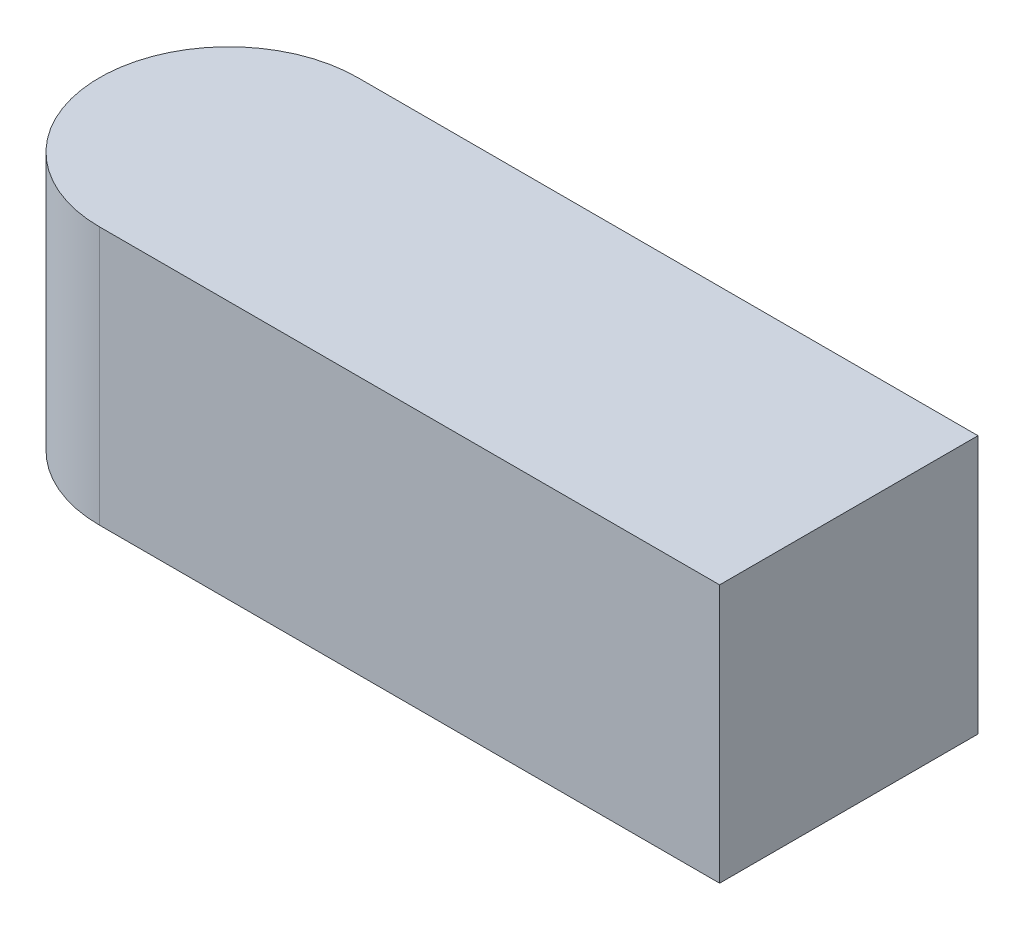
ISO-10303-21;
HEADER;
FILE_DESCRIPTION(('STEP AP214'),'2;1');
FILE_NAME('part.step','',(''),(''),'','','');
FILE_SCHEMA(('AUTOMOTIVE_DESIGN { 1 0 10303 214 1 1 1 1 }'));
ENDSEC;
DATA;
#1=APPLICATION_CONTEXT('core data for automotive mechanical design processes');
#2=APPLICATION_PROTOCOL_DEFINITION('international standard','automotive_design',2000,#1);
#3=PRODUCT_CONTEXT('',#1,'mechanical');
#4=PRODUCT('Part','Part','',(#3));
#5=PRODUCT_RELATED_PRODUCT_CATEGORY('part','',(#4));
#6=PRODUCT_DEFINITION_FORMATION('','',#4);
#7=PRODUCT_DEFINITION_CONTEXT('part definition',#1,'design');
#8=PRODUCT_DEFINITION('design','',#6,#7);
#9=PRODUCT_DEFINITION_SHAPE('','',#8);
#10=(LENGTH_UNIT() NAMED_UNIT(*) SI_UNIT(.MILLI.,.METRE.));
#11=(NAMED_UNIT(*) PLANE_ANGLE_UNIT() SI_UNIT($,.RADIAN.));
#12=(NAMED_UNIT(*) SI_UNIT($,.STERADIAN.) SOLID_ANGLE_UNIT());
#13=UNCERTAINTY_MEASURE_WITH_UNIT(LENGTH_MEASURE(1.E-05),#10,'distance_accuracy_value','');
#14=(GEOMETRIC_REPRESENTATION_CONTEXT(3) GLOBAL_UNCERTAINTY_ASSIGNED_CONTEXT((#13)) GLOBAL_UNIT_ASSIGNED_CONTEXT((#10,
#11,#12)) REPRESENTATION_CONTEXT('',''));
#15=CARTESIAN_POINT('',(0.,0.,0.));
#16=DIRECTION('',(0.,0.,1.));
#17=DIRECTION('',(1.,0.,0.));
#18=AXIS2_PLACEMENT_3D('',#15,#16,#17);
#19=CARTESIAN_POINT('',(0.,5.,0.));
#20=DIRECTION('',(0.,1.,0.));
#21=DIRECTION('',(1.,0.,0.));
#22=AXIS2_PLACEMENT_3D('',#19,#20,#21);
#23=PLANE('',#22);
#24=DIRECTION('',(-1.,0.,0.));
#25=VECTOR('',#24,1.);
#26=CARTESIAN_POINT('',(0.,5.,2.5));
#27=LINE('',#26,#25);
#28=CARTESIAN_POINT('',(12.,5.,2.5));
#29=VERTEX_POINT('',#28);
#30=CARTESIAN_POINT('',(0.,5.,2.5));
#31=VERTEX_POINT('',#30);
#32=EDGE_CURVE('E111',#29,#31,#27,.T.);
#33=ORIENTED_EDGE('',*,*,#32,.F.);
#34=DIRECTION('',(0.,0.,1.));
#35=VECTOR('',#34,1.);
#36=CARTESIAN_POINT('',(12.,5.,2.5));
#37=LINE('',#36,#35);
#38=CARTESIAN_POINT('',(12.,5.,-2.5));
#39=VERTEX_POINT('',#38);
#40=EDGE_CURVE('E104',#39,#29,#37,.T.);
#41=ORIENTED_EDGE('',*,*,#40,.F.);
#42=DIRECTION('',(1.,0.,0.));
#43=VECTOR('',#42,1.);
#44=CARTESIAN_POINT('',(12.,5.,-2.5));
#45=LINE('',#44,#43);
#46=CARTESIAN_POINT('',(0.,5.,-2.5));
#47=VERTEX_POINT('',#46);
#48=EDGE_CURVE('E11',#47,#39,#45,.T.);
#49=ORIENTED_EDGE('',*,*,#48,.F.);
#50=CARTESIAN_POINT('',(0.,5.,0.));
#51=DIRECTION('',(0.,-1.,0.));
#52=DIRECTION('',(0.,0.,1.));
#53=AXIS2_PLACEMENT_3D('',#50,#51,#52);
#54=CIRCLE('',#53,2.5);
#55=EDGE_CURVE('E44',#31,#47,#54,.T.);
#56=ORIENTED_EDGE('',*,*,#55,.F.);
#57=EDGE_LOOP('',(#33,#41,#49,#56));
#58=FACE_BOUND('',#57,.T.);
#59=ADVANCED_FACE('F17',(#58),#23,.T.);
#60=CARTESIAN_POINT('',(12.,0.,-2.5));
#61=DIRECTION('',(0.,0.,-1.));
#62=DIRECTION('',(0.,-1.,0.));
#63=AXIS2_PLACEMENT_3D('',#60,#61,#62);
#64=PLANE('',#63);
#65=DIRECTION('',(0.,-1.,0.));
#66=VECTOR('',#65,1.);
#67=CARTESIAN_POINT('',(0.,0.,-2.5));
#68=LINE('',#67,#66);
#69=CARTESIAN_POINT('',(0.,0.,-2.5));
#70=VERTEX_POINT('',#69);
#71=EDGE_CURVE('E25',#47,#70,#68,.T.);
#72=ORIENTED_EDGE('',*,*,#71,.F.);
#73=ORIENTED_EDGE('',*,*,#48,.T.);
#74=DIRECTION('',(0.,1.,0.));
#75=VECTOR('',#74,1.);
#76=CARTESIAN_POINT('',(12.,0.,-2.5));
#77=LINE('',#76,#75);
#78=CARTESIAN_POINT('',(12.,0.,-2.5));
#79=VERTEX_POINT('',#78);
#80=EDGE_CURVE('E83',#79,#39,#77,.T.);
#81=ORIENTED_EDGE('',*,*,#80,.F.);
#82=DIRECTION('',(-1.,0.,0.));
#83=VECTOR('',#82,1.);
#84=CARTESIAN_POINT('',(0.,0.,-2.5));
#85=LINE('',#84,#83);
#86=EDGE_CURVE('E80',#79,#70,#85,.T.);
#87=ORIENTED_EDGE('',*,*,#86,.T.);
#88=EDGE_LOOP('',(#72,#73,#81,#87));
#89=FACE_BOUND('',#88,.T.);
#90=ADVANCED_FACE('F81',(#89),#64,.T.);
#91=CARTESIAN_POINT('',(0.,0.,0.));
#92=DIRECTION('',(0.,1.,0.));
#93=DIRECTION('',(0.,0.,1.));
#94=AXIS2_PLACEMENT_3D('',#91,#92,#93);
#95=CYLINDRICAL_SURFACE('',#94,2.5);
#96=DIRECTION('',(0.,-1.,0.));
#97=VECTOR('',#96,1.);
#98=CARTESIAN_POINT('',(0.,0.,2.5));
#99=LINE('',#98,#97);
#100=CARTESIAN_POINT('',(0.,0.,2.5));
#101=VERTEX_POINT('',#100);
#102=EDGE_CURVE('E115',#31,#101,#99,.T.);
#103=ORIENTED_EDGE('',*,*,#102,.F.);
#104=ORIENTED_EDGE('',*,*,#55,.T.);
#105=ORIENTED_EDGE('',*,*,#71,.T.);
#106=CARTESIAN_POINT('',(0.,0.,0.));
#107=DIRECTION('',(0.,1.,0.));
#108=DIRECTION('',(0.,0.,1.));
#109=AXIS2_PLACEMENT_3D('',#106,#107,#108);
#110=CIRCLE('',#109,2.5);
#111=EDGE_CURVE('E74',#70,#101,#110,.T.);
#112=ORIENTED_EDGE('',*,*,#111,.T.);
#113=EDGE_LOOP('',(#103,#104,#105,#112));
#114=FACE_BOUND('',#113,.T.);
#115=ADVANCED_FACE('F72',(#114),#95,.T.);
#116=CARTESIAN_POINT('',(0.,0.,2.5));
#117=DIRECTION('',(0.,0.,1.));
#118=DIRECTION('',(1.,0.,0.));
#119=AXIS2_PLACEMENT_3D('',#116,#117,#118);
#120=PLANE('',#119);
#121=DIRECTION('',(0.,-1.,0.));
#122=VECTOR('',#121,1.);
#123=CARTESIAN_POINT('',(12.,0.,2.5));
#124=LINE('',#123,#122);
#125=CARTESIAN_POINT('',(12.,0.,2.5));
#126=VERTEX_POINT('',#125);
#127=EDGE_CURVE('E108',#29,#126,#124,.T.);
#128=ORIENTED_EDGE('',*,*,#127,.F.);
#129=ORIENTED_EDGE('',*,*,#32,.T.);
#130=ORIENTED_EDGE('',*,*,#102,.T.);
#131=DIRECTION('',(1.,0.,0.));
#132=VECTOR('',#131,1.);
#133=CARTESIAN_POINT('',(0.,0.,2.5));
#134=LINE('',#133,#132);
#135=EDGE_CURVE('E92',#101,#126,#134,.T.);
#136=ORIENTED_EDGE('',*,*,#135,.T.);
#137=EDGE_LOOP('',(#128,#129,#130,#136));
#138=FACE_BOUND('',#137,.T.);
#139=ADVANCED_FACE('F146',(#138),#120,.T.);
#140=CARTESIAN_POINT('',(12.,0.,2.5));
#141=DIRECTION('',(1.,0.,0.));
#142=DIRECTION('',(0.,1.,0.));
#143=AXIS2_PLACEMENT_3D('',#140,#141,#142);
#144=PLANE('',#143);
#145=ORIENTED_EDGE('',*,*,#80,.T.);
#146=ORIENTED_EDGE('',*,*,#40,.T.);
#147=ORIENTED_EDGE('',*,*,#127,.T.);
#148=DIRECTION('',(0.,0.,-1.));
#149=VECTOR('',#148,1.);
#150=CARTESIAN_POINT('',(12.,0.,0.));
#151=LINE('',#150,#149);
#152=EDGE_CURVE('E88',#126,#79,#151,.T.);
#153=ORIENTED_EDGE('',*,*,#152,.T.);
#154=EDGE_LOOP('',(#145,#146,#147,#153));
#155=FACE_BOUND('',#154,.T.);
#156=ADVANCED_FACE('F135',(#155),#144,.T.);
#157=CARTESIAN_POINT('',(0.,0.,0.));
#158=DIRECTION('',(0.,1.,0.));
#159=DIRECTION('',(1.,0.,0.));
#160=AXIS2_PLACEMENT_3D('',#157,#158,#159);
#161=PLANE('',#160);
#162=ORIENTED_EDGE('',*,*,#135,.F.);
#163=ORIENTED_EDGE('',*,*,#111,.F.);
#164=ORIENTED_EDGE('',*,*,#86,.F.);
#165=ORIENTED_EDGE('',*,*,#152,.F.);
#166=EDGE_LOOP('',(#162,#163,#164,#165));
#167=FACE_BOUND('',#166,.T.);
#168=ADVANCED_FACE('F90',(#167),#161,.F.);
#169=CLOSED_SHELL('',(#59,#90,#115,#139,#156,#168));
#170=MANIFOLD_SOLID_BREP('B1',#169);
#171=ADVANCED_BREP_SHAPE_REPRESENTATION('',(#18,#170),#14);
#172=SHAPE_DEFINITION_REPRESENTATION(#9,#171);
ENDSEC;
END-ISO-10303-21;
